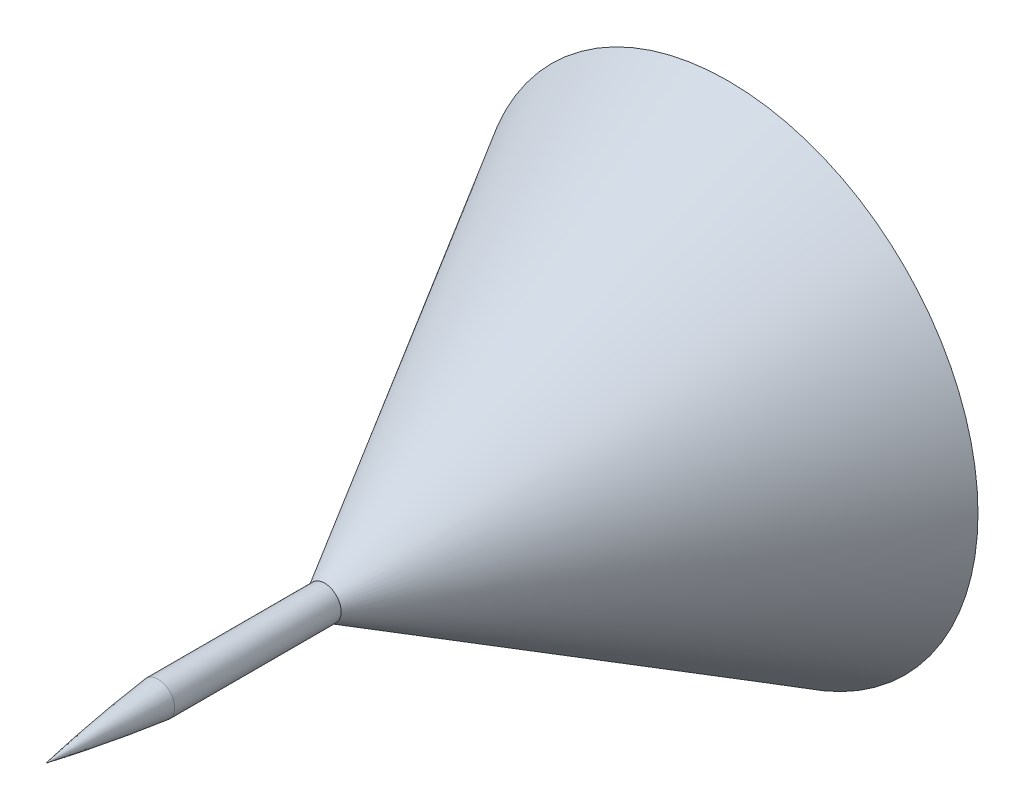
ISO-10303-21;
HEADER;
FILE_DESCRIPTION(('STEP AP214'),'2;1');
FILE_NAME('part.step','',(''),(''),'','','');
FILE_SCHEMA(('AUTOMOTIVE_DESIGN { 1 0 10303 214 1 1 1 1 }'));
ENDSEC;
DATA;
#1=APPLICATION_CONTEXT('core data for automotive mechanical design processes');
#2=APPLICATION_PROTOCOL_DEFINITION('international standard','automotive_design',2000,#1);
#3=PRODUCT_CONTEXT('',#1,'mechanical');
#4=PRODUCT('Part','Part','',(#3));
#5=PRODUCT_RELATED_PRODUCT_CATEGORY('part','',(#4));
#6=PRODUCT_DEFINITION_FORMATION('','',#4);
#7=PRODUCT_DEFINITION_CONTEXT('part definition',#1,'design');
#8=PRODUCT_DEFINITION('design','',#6,#7);
#9=PRODUCT_DEFINITION_SHAPE('','',#8);
#10=(LENGTH_UNIT() NAMED_UNIT(*) SI_UNIT(.MILLI.,.METRE.));
#11=(NAMED_UNIT(*) PLANE_ANGLE_UNIT() SI_UNIT($,.RADIAN.));
#12=(NAMED_UNIT(*) SI_UNIT($,.STERADIAN.) SOLID_ANGLE_UNIT());
#13=UNCERTAINTY_MEASURE_WITH_UNIT(LENGTH_MEASURE(1.E-05),#10,'distance_accuracy_value','');
#14=(GEOMETRIC_REPRESENTATION_CONTEXT(3) GLOBAL_UNCERTAINTY_ASSIGNED_CONTEXT((#13)) GLOBAL_UNIT_ASSIGNED_CONTEXT((#10,
#11,#12)) REPRESENTATION_CONTEXT('',''));
#15=CARTESIAN_POINT('',(0.,0.,0.));
#16=DIRECTION('',(0.,0.,1.));
#17=DIRECTION('',(1.,0.,0.));
#18=AXIS2_PLACEMENT_3D('',#15,#16,#17);
#19=CARTESIAN_POINT('',(0.,0.,0.));
#20=DIRECTION('',(0.,0.,-1.));
#21=DIRECTION('',(-1.,0.,0.));
#22=AXIS2_PLACEMENT_3D('',#19,#20,#21);
#23=CONICAL_SURFACE('',#22,0.,0.5235987755983);
#24=CARTESIAN_POINT('',(0.,0.,-0.866025403784434));
#25=DIRECTION('',(0.,0.,-1.));
#26=DIRECTION('',(-1.,0.,0.));
#27=AXIS2_PLACEMENT_3D('',#24,#25,#26);
#28=CIRCLE('',#27,0.499999999999999);
#29=CARTESIAN_POINT('',(-0.499999999999999,0.,-0.866025403784434));
#30=VERTEX_POINT('',#29);
#31=EDGE_CURVE('E11',#30,#30,#28,.F.);
#32=CARTESIAN_POINT('',(0.,0.,-12.9903810567665));
#33=DIRECTION('',(0.,0.,1.));
#34=DIRECTION('',(1.,0.,0.));
#35=AXIS2_PLACEMENT_3D('',#32,#33,#34);
#36=CIRCLE('',#35,7.5);
#37=CARTESIAN_POINT('',(-7.5,0.,-12.9903810567665));
#38=VERTEX_POINT('',#37);
#39=EDGE_CURVE('E47',#38,#38,#36,.T.);
#40=CARTESIAN_POINT('',(-0.499999999999999,0.,-0.866025403784434));
#41=CARTESIAN_POINT('',(-0.572916666666666,0.,-0.992320775169665));
#42=CARTESIAN_POINT('',(-0.645833333333333,0.,-1.11861614655489));
#43=CARTESIAN_POINT('',(-0.791666666666666,0.,-1.37120688932536));
#44=CARTESIAN_POINT('',(-0.864583333333333,0.,-1.49750226071059));
#45=CARTESIAN_POINT('',(-1.01041666666667,0.,-1.75009300348105));
#46=CARTESIAN_POINT('',(-1.08333333333333,0.,-1.87638837486628));
#47=CARTESIAN_POINT('',(-1.22916666666667,0.,-2.12897911763674));
#48=CARTESIAN_POINT('',(-1.30208333333333,0.,-2.25527448902197));
#49=CARTESIAN_POINT('',(-1.44791666666667,0.,-2.50786523179243));
#50=CARTESIAN_POINT('',(-1.52083333333333,0.,-2.63416060317766));
#51=CARTESIAN_POINT('',(-1.66666666666667,0.,-2.88675134594812));
#52=CARTESIAN_POINT('',(-1.73958333333333,0.,-3.01304671733335));
#53=CARTESIAN_POINT('',(-1.88541666666667,0.,-3.26563746010381));
#54=CARTESIAN_POINT('',(-1.95833333333333,0.,-3.39193283148904));
#55=CARTESIAN_POINT('',(-2.10416666666667,0.,-3.6445235742595));
#56=CARTESIAN_POINT('',(-2.17708333333333,0.,-3.77081894564473));
#57=CARTESIAN_POINT('',(-2.32291666666667,0.,-4.02340968841519));
#58=CARTESIAN_POINT('',(-2.39583333333333,0.,-4.14970505980042));
#59=CARTESIAN_POINT('',(-2.54166666666667,0.,-4.40229580257088));
#60=CARTESIAN_POINT('',(-2.61458333333333,0.,-4.52859117395611));
#61=CARTESIAN_POINT('',(-2.76041666666667,0.,-4.78118191672657));
#62=CARTESIAN_POINT('',(-2.83333333333333,0.,-4.9074772881118));
#63=CARTESIAN_POINT('',(-2.97916666666667,0.,-5.16006803088226));
#64=CARTESIAN_POINT('',(-3.05208333333333,0.,-5.28636340226749));
#65=CARTESIAN_POINT('',(-3.19791666666667,0.,-5.53895414503795));
#66=CARTESIAN_POINT('',(-3.27083333333333,0.,-5.66524951642318));
#67=CARTESIAN_POINT('',(-3.41666666666667,0.,-5.91784025919364));
#68=CARTESIAN_POINT('',(-3.48958333333333,0.,-6.04413563057887));
#69=CARTESIAN_POINT('',(-3.63541666666667,0.,-6.29672637334933));
#70=CARTESIAN_POINT('',(-3.70833333333333,0.,-6.42302174473456));
#71=CARTESIAN_POINT('',(-3.85416666666667,0.,-6.67561248750502));
#72=CARTESIAN_POINT('',(-3.92708333333333,0.,-6.80190785889025));
#73=CARTESIAN_POINT('',(-4.07291666666667,0.,-7.05449860166071));
#74=CARTESIAN_POINT('',(-4.14583333333333,0.,-7.18079397304594));
#75=CARTESIAN_POINT('',(-4.29166666666667,0.,-7.4333847158164));
#76=CARTESIAN_POINT('',(-4.36458333333333,0.,-7.55968008720164));
#77=CARTESIAN_POINT('',(-4.51041666666667,0.,-7.8122708299721));
#78=CARTESIAN_POINT('',(-4.58333333333333,0.,-7.93856620135733));
#79=CARTESIAN_POINT('',(-4.72916666666667,0.,-8.19115694412779));
#80=CARTESIAN_POINT('',(-4.80208333333333,0.,-8.31745231551302));
#81=CARTESIAN_POINT('',(-4.94791666666667,0.,-8.57004305828348));
#82=CARTESIAN_POINT('',(-5.02083333333333,0.,-8.69633842966871));
#83=CARTESIAN_POINT('',(-5.16666666666667,0.,-8.94892917243917));
#84=CARTESIAN_POINT('',(-5.23958333333333,0.,-9.0752245438244));
#85=CARTESIAN_POINT('',(-5.38541666666667,0.,-9.32781528659486));
#86=CARTESIAN_POINT('',(-5.45833333333333,0.,-9.45411065798009));
#87=CARTESIAN_POINT('',(-5.60416666666667,0.,-9.70670140075055));
#88=CARTESIAN_POINT('',(-5.67708333333333,0.,-9.83299677213578));
#89=CARTESIAN_POINT('',(-5.82291666666667,0.,-10.0855875149062));
#90=CARTESIAN_POINT('',(-5.89583333333333,0.,-10.2118828862915));
#91=CARTESIAN_POINT('',(-6.04166666666667,0.,-10.4644736290619));
#92=CARTESIAN_POINT('',(-6.11458333333333,0.,-10.5907690004472));
#93=CARTESIAN_POINT('',(-6.26041666666667,0.,-10.8433597432176));
#94=CARTESIAN_POINT('',(-6.33333333333333,0.,-10.9696551146029));
#95=CARTESIAN_POINT('',(-6.47916666666667,0.,-11.2222458573733));
#96=CARTESIAN_POINT('',(-6.55208333333333,0.,-11.3485412287585));
#97=CARTESIAN_POINT('',(-6.69791666666667,0.,-11.601131971529));
#98=CARTESIAN_POINT('',(-6.77083333333333,0.,-11.7274273429142));
#99=CARTESIAN_POINT('',(-6.91666666666667,0.,-11.9800180856847));
#100=CARTESIAN_POINT('',(-6.98958333333333,0.,-12.1063134570699));
#101=CARTESIAN_POINT('',(-7.13541666666667,0.,-12.3589041998404));
#102=CARTESIAN_POINT('',(-7.20833333333333,0.,-12.4851995712256));
#103=CARTESIAN_POINT('',(-7.35416666666667,0.,-12.7377903139961));
#104=CARTESIAN_POINT('',(-7.42708333333333,0.,-12.8640856853813));
#105=CARTESIAN_POINT('',(-7.5,0.,-12.9903810567665));
#106=B_SPLINE_CURVE_WITH_KNOTS('',3,(#40,#41,#42,#43,#44,#45,#46,#47,#48,#49,#50,#51,#52,#53,
#54,#55,#56,#57,#58,#59,#60,#61,#62,#63,#64,#65,#66,#67,#68,#69,#70,#71,#72,#73,#74,#75,#76,#77,
#78,#79,#80,#81,#82,#83,#84,#85,#86,#87,#88,#89,#90,#91,#92,#93,#94,#95,#96,#97,#98,#99,#100,
#101,#102,#103,#104,#105),.UNSPECIFIED.,.F.,.F.,(4,2,2,2,2,2,2,2,2,2,2,2,2,2,2,2,2,2,2,2,2,2,2,
2,2,2,2,2,2,2,2,2,4),(0.,0.437499999999999,0.874999999999998,1.3125,1.75,2.18749999999999,
2.62499999999999,3.06249999999999,3.49999999999999,3.93749999999999,4.37499999999999,
4.81249999999999,5.24999999999999,5.68749999999999,6.12499999999999,6.56249999999998,
6.99999999999998,7.43749999999998,7.87499999999998,8.31249999999998,8.74999999999998,
9.18749999999998,9.62499999999998,10.0625,10.5,10.9375,11.375,11.8125,12.25,12.6875,13.125,
13.5625,14.),.UNSPECIFIED.);
#107=EDGE_CURVE('BSEAM39',#30,#38,#106,.T.);
#108=ORIENTED_EDGE('',*,*,#31,.F.);
#109=ORIENTED_EDGE('',*,*,#39,.T.);
#110=ORIENTED_EDGE('',*,*,#107,.T.);
#111=ORIENTED_EDGE('',*,*,#107,.F.);
#112=EDGE_LOOP('',(#108,#110,#109,#111));
#113=FACE_BOUND('',#112,.T.);
#114=ADVANCED_FACE('F39',(#113),#23,.T.);
#115=CARTESIAN_POINT('',(0.,7.5,-12.9903810567665));
#116=DIRECTION('',(0.,0.,-1.));
#117=DIRECTION('',(-1.,0.,0.));
#118=AXIS2_PLACEMENT_3D('',#115,#116,#117);
#119=PLANE('',#118);
#120=CARTESIAN_POINT('',(0.,0.,-12.9903810567665));
#121=DIRECTION('',(0.,0.,1.));
#122=DIRECTION('',(1.,0.,0.));
#123=AXIS2_PLACEMENT_3D('',#120,#121,#122);
#124=CIRCLE('',#123,6.34529946162074);
#125=CARTESIAN_POINT('',(6.34529946162074,0.,-12.9903810567665));
#126=VERTEX_POINT('',#125);
#127=EDGE_CURVE('E64',#126,#126,#124,.T.);
#128=ORIENTED_EDGE('',*,*,#127,.T.);
#129=EDGE_LOOP('',(#128));
#130=FACE_BOUND('',#129,.T.);
#131=ORIENTED_EDGE('',*,*,#39,.F.);
#132=EDGE_LOOP('',(#131));
#133=FACE_BOUND('',#132,.T.);
#134=ADVANCED_FACE('F78',(#130,#133),#119,.T.);
#135=CARTESIAN_POINT('',(0.,0.,-2.));
#136=DIRECTION('',(0.,0.,-1.));
#137=DIRECTION('',(-1.,0.,0.));
#138=AXIS2_PLACEMENT_3D('',#135,#136,#137);
#139=CONICAL_SURFACE('',#138,0.,0.5235987755983);
#140=ORIENTED_EDGE('',*,*,#127,.F.);
#141=EDGE_LOOP('',(#140));
#142=FACE_BOUND('',#141,.T.);
#143=CARTESIAN_POINT('',(0.,0.,-2.));
#144=VERTEX_POINT('',#143);
#145=VERTEX_LOOP('',#144);
#146=FACE_BOUND('',#145,.T.);
#147=ADVANCED_FACE('F57',(#142,#146),#139,.F.);
#148=CARTESIAN_POINT('',(-0.5,0.,4.13397459621558));
#149=CARTESIAN_POINT('',(-0.31193327544821,0.,5.82668196228046));
#150=CARTESIAN_POINT('',(0.,0.,7.5));
#151=B_SPLINE_CURVE_WITH_KNOTS('',2,(#148,#149,#150),.UNSPECIFIED.,.F.,.F.,(3,3),(0.,1.),.UNSPECIFIED.);
#152=CARTESIAN_POINT('',(0.,0.,0.));
#153=DIRECTION('',(0.,0.,-1.));
#154=AXIS1_PLACEMENT('',#152,#153);
#155=SURFACE_OF_REVOLUTION('',#151,#154);
#156=CARTESIAN_POINT('',(0.,0.,7.5));
#157=VERTEX_POINT('',#156);
#158=VERTEX_LOOP('',#157);
#159=FACE_BOUND('',#158,.T.);
#160=CARTESIAN_POINT('',(0.,0.,4.13397459621558));
#161=DIRECTION('',(0.,0.,-1.));
#162=DIRECTION('',(-1.,0.,0.));
#163=AXIS2_PLACEMENT_3D('',#160,#161,#162);
#164=CIRCLE('',#163,0.5);
#165=CARTESIAN_POINT('',(-0.499999999999999,0.,4.13397459621558));
#166=VERTEX_POINT('',#165);
#167=EDGE_CURVE('E61',#166,#166,#164,.T.);
#168=ORIENTED_EDGE('',*,*,#167,.F.);
#169=EDGE_LOOP('',(#168));
#170=FACE_BOUND('',#169,.T.);
#171=ADVANCED_FACE('F53',(#159,#170),#155,.F.);
#172=CARTESIAN_POINT('',(0.,0.,0.));
#173=DIRECTION('',(0.,0.,-1.));
#174=DIRECTION('',(-1.,0.,0.));
#175=AXIS2_PLACEMENT_3D('',#172,#173,#174);
#176=CYLINDRICAL_SURFACE('',#175,0.499999999999999);
#177=ORIENTED_EDGE('',*,*,#167,.T.);
#178=EDGE_LOOP('',(#177));
#179=FACE_BOUND('',#178,.T.);
#180=ORIENTED_EDGE('',*,*,#31,.T.);
#181=EDGE_LOOP('',(#180));
#182=FACE_BOUND('',#181,.T.);
#183=ADVANCED_FACE('F56',(#179,#182),#176,.T.);
#184=CLOSED_SHELL('',(#114,#134,#147,#171,#183));
#185=MANIFOLD_SOLID_BREP('B2',#184);
#186=ADVANCED_BREP_SHAPE_REPRESENTATION('',(#18,#185),#14);
#187=SHAPE_DEFINITION_REPRESENTATION(#9,#186);
ENDSEC;
END-ISO-10303-21;
